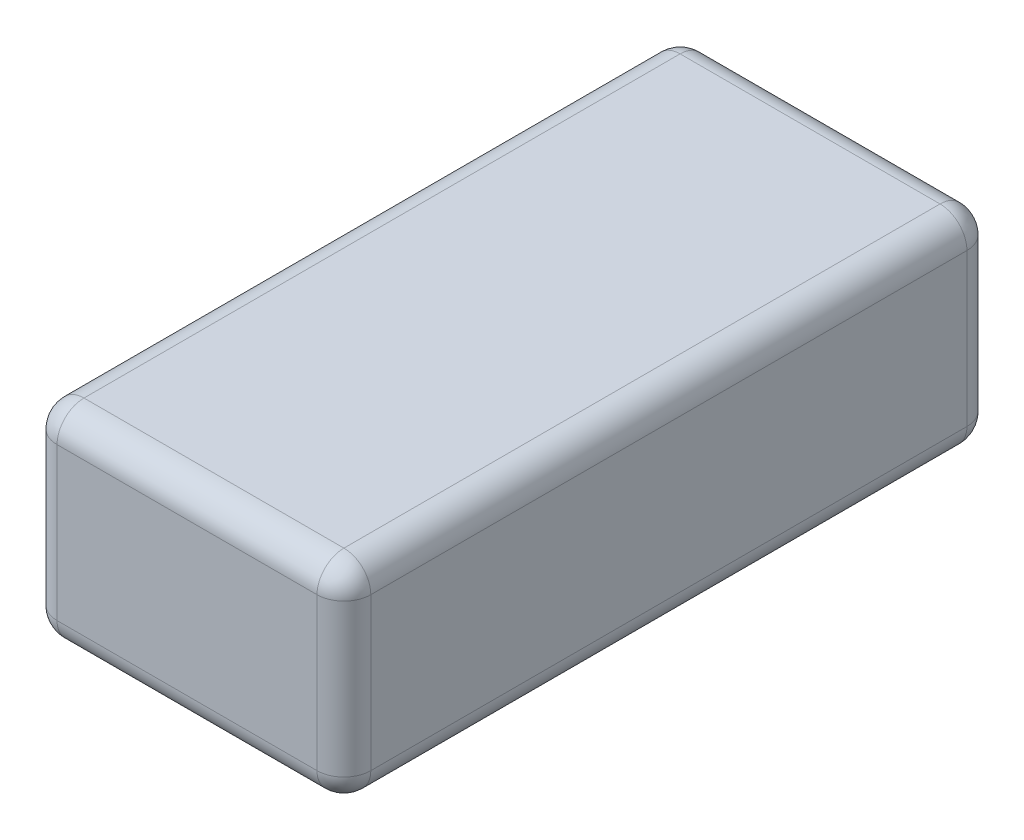
ISO-10303-21;
HEADER;
FILE_DESCRIPTION(('STEP AP214'),'2;1');
FILE_NAME('part.step','',(''),(''),'','','');
FILE_SCHEMA(('AUTOMOTIVE_DESIGN { 1 0 10303 214 1 1 1 1 }'));
ENDSEC;
DATA;
#1=APPLICATION_CONTEXT('core data for automotive mechanical design processes');
#2=APPLICATION_PROTOCOL_DEFINITION('international standard','automotive_design',2000,#1);
#3=PRODUCT_CONTEXT('',#1,'mechanical');
#4=PRODUCT('Part','Part','',(#3));
#5=PRODUCT_RELATED_PRODUCT_CATEGORY('part','',(#4));
#6=PRODUCT_DEFINITION_FORMATION('','',#4);
#7=PRODUCT_DEFINITION_CONTEXT('part definition',#1,'design');
#8=PRODUCT_DEFINITION('design','',#6,#7);
#9=PRODUCT_DEFINITION_SHAPE('','',#8);
#10=(LENGTH_UNIT() NAMED_UNIT(*) SI_UNIT(.MILLI.,.METRE.));
#11=(NAMED_UNIT(*) PLANE_ANGLE_UNIT() SI_UNIT($,.RADIAN.));
#12=(NAMED_UNIT(*) SI_UNIT($,.STERADIAN.) SOLID_ANGLE_UNIT());
#13=UNCERTAINTY_MEASURE_WITH_UNIT(LENGTH_MEASURE(1.E-05),#10,'distance_accuracy_value','');
#14=(GEOMETRIC_REPRESENTATION_CONTEXT(3) GLOBAL_UNCERTAINTY_ASSIGNED_CONTEXT((#13)) GLOBAL_UNIT_ASSIGNED_CONTEXT((#10,
#11,#12)) REPRESENTATION_CONTEXT('',''));
#15=CARTESIAN_POINT('',(0.,0.,0.));
#16=DIRECTION('',(0.,0.,1.));
#17=DIRECTION('',(1.,0.,0.));
#18=AXIS2_PLACEMENT_3D('',#15,#16,#17);
#19=CARTESIAN_POINT('',(17.5,23.,-36.25));
#20=DIRECTION('',(-1.,0.,0.));
#21=DIRECTION('',(0.,0.,1.));
#22=AXIS2_PLACEMENT_3D('',#19,#20,#21);
#23=PLANE('',#22);
#24=DIRECTION('',(0.,-1.,0.));
#25=VECTOR('',#24,1.);
#26=CARTESIAN_POINT('',(17.5,23.,33.25));
#27=LINE('',#26,#25);
#28=CARTESIAN_POINT('',(17.5,20.,33.25));
#29=VERTEX_POINT('',#28);
#30=CARTESIAN_POINT('',(17.5,3.,33.25));
#31=VERTEX_POINT('',#30);
#32=EDGE_CURVE('E184',#29,#31,#27,.T.);
#33=ORIENTED_EDGE('',*,*,#32,.T.);
#34=DIRECTION('',(0.,0.,-1.));
#35=VECTOR('',#34,1.);
#36=CARTESIAN_POINT('',(17.5,3.,-36.25));
#37=LINE('',#36,#35);
#38=CARTESIAN_POINT('',(17.5,3.,-33.25));
#39=VERTEX_POINT('',#38);
#40=EDGE_CURVE('E187',#31,#39,#37,.T.);
#41=ORIENTED_EDGE('',*,*,#40,.T.);
#42=DIRECTION('',(0.,-1.,0.));
#43=VECTOR('',#42,1.);
#44=CARTESIAN_POINT('',(17.5,23.,-33.25));
#45=LINE('',#44,#43);
#46=CARTESIAN_POINT('',(17.5,20.,-33.25));
#47=VERTEX_POINT('',#46);
#48=EDGE_CURVE('E182',#39,#47,#45,.F.);
#49=ORIENTED_EDGE('',*,*,#48,.T.);
#50=DIRECTION('',(0.,0.,-1.));
#51=VECTOR('',#50,1.);
#52=CARTESIAN_POINT('',(17.5,20.,36.25));
#53=LINE('',#52,#51);
#54=EDGE_CURVE('E180',#47,#29,#53,.F.);
#55=ORIENTED_EDGE('',*,*,#54,.T.);
#56=EDGE_LOOP('',(#33,#41,#49,#55));
#57=FACE_BOUND('',#56,.T.);
#58=ADVANCED_FACE('F33',(#57),#23,.F.);
#59=CARTESIAN_POINT('',(-17.5,23.,-36.25));
#60=DIRECTION('',(0.,0.,1.));
#61=DIRECTION('',(1.,0.,0.));
#62=AXIS2_PLACEMENT_3D('',#59,#60,#61);
#63=PLANE('',#62);
#64=DIRECTION('',(0.,-1.,0.));
#65=VECTOR('',#64,1.);
#66=CARTESIAN_POINT('',(14.5,23.,-36.25));
#67=LINE('',#66,#65);
#68=CARTESIAN_POINT('',(14.5,20.,-36.25));
#69=VERTEX_POINT('',#68);
#70=CARTESIAN_POINT('',(14.5,3.,-36.25));
#71=VERTEX_POINT('',#70);
#72=EDGE_CURVE('E166',#69,#71,#67,.T.);
#73=ORIENTED_EDGE('',*,*,#72,.T.);
#74=DIRECTION('',(-1.,0.,0.));
#75=VECTOR('',#74,1.);
#76=CARTESIAN_POINT('',(-17.5,3.,-36.25));
#77=LINE('',#76,#75);
#78=CARTESIAN_POINT('',(-14.5,3.,-36.25));
#79=VERTEX_POINT('',#78);
#80=EDGE_CURVE('E171',#71,#79,#77,.T.);
#81=ORIENTED_EDGE('',*,*,#80,.T.);
#82=DIRECTION('',(0.,-1.,0.));
#83=VECTOR('',#82,1.);
#84=CARTESIAN_POINT('',(-14.5,23.,-36.25));
#85=LINE('',#84,#83);
#86=CARTESIAN_POINT('',(-14.5,20.,-36.25));
#87=VERTEX_POINT('',#86);
#88=EDGE_CURVE('E168',#79,#87,#85,.F.);
#89=ORIENTED_EDGE('',*,*,#88,.T.);
#90=DIRECTION('',(-1.,0.,0.));
#91=VECTOR('',#90,1.);
#92=CARTESIAN_POINT('',(17.5,20.,-36.25));
#93=LINE('',#92,#91);
#94=EDGE_CURVE('E164',#87,#69,#93,.F.);
#95=ORIENTED_EDGE('',*,*,#94,.T.);
#96=EDGE_LOOP('',(#73,#81,#89,#95));
#97=FACE_BOUND('',#96,.T.);
#98=ADVANCED_FACE('F305',(#97),#63,.F.);
#99=CARTESIAN_POINT('',(-17.5,23.,-36.25));
#100=DIRECTION('',(1.,0.,0.));
#101=DIRECTION('',(0.,0.,-1.));
#102=AXIS2_PLACEMENT_3D('',#99,#100,#101);
#103=PLANE('',#102);
#104=DIRECTION('',(0.,-1.,0.));
#105=VECTOR('',#104,1.);
#106=CARTESIAN_POINT('',(-17.5,23.,-33.25));
#107=LINE('',#106,#105);
#108=CARTESIAN_POINT('',(-17.5,20.,-33.25));
#109=VERTEX_POINT('',#108);
#110=CARTESIAN_POINT('',(-17.5,3.,-33.25));
#111=VERTEX_POINT('',#110);
#112=EDGE_CURVE('E132',#109,#111,#107,.T.);
#113=ORIENTED_EDGE('',*,*,#112,.T.);
#114=DIRECTION('',(0.,0.,1.));
#115=VECTOR('',#114,1.);
#116=CARTESIAN_POINT('',(-17.5,3.,-36.25));
#117=LINE('',#116,#115);
#118=CARTESIAN_POINT('',(-17.5,3.,33.25));
#119=VERTEX_POINT('',#118);
#120=EDGE_CURVE('E128',#111,#119,#117,.T.);
#121=ORIENTED_EDGE('',*,*,#120,.T.);
#122=DIRECTION('',(0.,-1.,0.));
#123=VECTOR('',#122,1.);
#124=CARTESIAN_POINT('',(-17.5,23.,33.25));
#125=LINE('',#124,#123);
#126=CARTESIAN_POINT('',(-17.5,20.,33.25));
#127=VERTEX_POINT('',#126);
#128=EDGE_CURVE('E120',#119,#127,#125,.F.);
#129=ORIENTED_EDGE('',*,*,#128,.T.);
#130=DIRECTION('',(0.,0.,1.));
#131=VECTOR('',#130,1.);
#132=CARTESIAN_POINT('',(-17.5,20.,-36.25));
#133=LINE('',#132,#131);
#134=EDGE_CURVE('E125',#127,#109,#133,.F.);
#135=ORIENTED_EDGE('',*,*,#134,.T.);
#136=EDGE_LOOP('',(#113,#121,#129,#135));
#137=FACE_BOUND('',#136,.T.);
#138=ADVANCED_FACE('F123',(#137),#103,.F.);
#139=CARTESIAN_POINT('',(-17.5,23.,36.25));
#140=DIRECTION('',(0.,0.,-1.));
#141=DIRECTION('',(-1.,0.,0.));
#142=AXIS2_PLACEMENT_3D('',#139,#140,#141);
#143=PLANE('',#142);
#144=DIRECTION('',(0.,-1.,0.));
#145=VECTOR('',#144,1.);
#146=CARTESIAN_POINT('',(-14.5,23.,36.25));
#147=LINE('',#146,#145);
#148=CARTESIAN_POINT('',(-14.5,20.,36.25));
#149=VERTEX_POINT('',#148);
#150=CARTESIAN_POINT('',(-14.5,3.,36.25));
#151=VERTEX_POINT('',#150);
#152=EDGE_CURVE('E140',#149,#151,#147,.T.);
#153=ORIENTED_EDGE('',*,*,#152,.T.);
#154=DIRECTION('',(1.,0.,0.));
#155=VECTOR('',#154,1.);
#156=CARTESIAN_POINT('',(-17.5,3.,36.25));
#157=LINE('',#156,#155);
#158=CARTESIAN_POINT('',(14.5,3.,36.25));
#159=VERTEX_POINT('',#158);
#160=EDGE_CURVE('E178',#151,#159,#157,.T.);
#161=ORIENTED_EDGE('',*,*,#160,.T.);
#162=DIRECTION('',(0.,-1.,0.));
#163=VECTOR('',#162,1.);
#164=CARTESIAN_POINT('',(14.5,23.,36.25));
#165=LINE('',#164,#163);
#166=CARTESIAN_POINT('',(14.5,20.,36.25));
#167=VERTEX_POINT('',#166);
#168=EDGE_CURVE('E175',#159,#167,#165,.F.);
#169=ORIENTED_EDGE('',*,*,#168,.T.);
#170=DIRECTION('',(1.,0.,0.));
#171=VECTOR('',#170,1.);
#172=CARTESIAN_POINT('',(-17.5,20.,36.25));
#173=LINE('',#172,#171);
#174=EDGE_CURVE('E173',#167,#149,#173,.F.);
#175=ORIENTED_EDGE('',*,*,#174,.T.);
#176=EDGE_LOOP('',(#153,#161,#169,#175));
#177=FACE_BOUND('',#176,.T.);
#178=ADVANCED_FACE('F296',(#177),#143,.F.);
#179=CARTESIAN_POINT('',(0.,23.,0.));
#180=DIRECTION('',(0.,1.,0.));
#181=DIRECTION('',(0.,0.,1.));
#182=AXIS2_PLACEMENT_3D('',#179,#180,#181);
#183=PLANE('',#182);
#184=DIRECTION('',(0.,0.,1.));
#185=VECTOR('',#184,1.);
#186=CARTESIAN_POINT('',(-14.5,23.,36.25));
#187=LINE('',#186,#185);
#188=CARTESIAN_POINT('',(-14.5,23.,-33.25));
#189=VERTEX_POINT('',#188);
#190=CARTESIAN_POINT('',(-14.5,23.,33.25));
#191=VERTEX_POINT('',#190);
#192=EDGE_CURVE('E42',#189,#191,#187,.T.);
#193=ORIENTED_EDGE('',*,*,#192,.T.);
#194=DIRECTION('',(1.,0.,0.));
#195=VECTOR('',#194,1.);
#196=CARTESIAN_POINT('',(17.5,23.,33.25));
#197=LINE('',#196,#195);
#198=CARTESIAN_POINT('',(14.5,23.,33.25));
#199=VERTEX_POINT('',#198);
#200=EDGE_CURVE('E11',#191,#199,#197,.T.);
#201=ORIENTED_EDGE('',*,*,#200,.T.);
#202=DIRECTION('',(0.,0.,-1.));
#203=VECTOR('',#202,1.);
#204=CARTESIAN_POINT('',(14.5,23.,-36.25));
#205=LINE('',#204,#203);
#206=CARTESIAN_POINT('',(14.5,23.,-33.25));
#207=VERTEX_POINT('',#206);
#208=EDGE_CURVE('E198',#199,#207,#205,.T.);
#209=ORIENTED_EDGE('',*,*,#208,.T.);
#210=DIRECTION('',(-1.,0.,0.));
#211=VECTOR('',#210,1.);
#212=CARTESIAN_POINT('',(-17.5,23.,-33.25));
#213=LINE('',#212,#211);
#214=EDGE_CURVE('E53',#207,#189,#213,.T.);
#215=ORIENTED_EDGE('',*,*,#214,.T.);
#216=EDGE_LOOP('',(#193,#201,#209,#215));
#217=FACE_BOUND('',#216,.T.);
#218=ADVANCED_FACE('F298',(#217),#183,.T.);
#219=CARTESIAN_POINT('',(0.,0.,0.));
#220=DIRECTION('',(0.,1.,0.));
#221=DIRECTION('',(0.,0.,1.));
#222=AXIS2_PLACEMENT_3D('',#219,#220,#221);
#223=PLANE('',#222);
#224=DIRECTION('',(0.,0.,1.));
#225=VECTOR('',#224,1.);
#226=CARTESIAN_POINT('',(-14.5,0.,0.));
#227=LINE('',#226,#225);
#228=CARTESIAN_POINT('',(-14.5,0.,33.25));
#229=VERTEX_POINT('',#228);
#230=CARTESIAN_POINT('',(-14.5,0.,-33.25));
#231=VERTEX_POINT('',#230);
#232=EDGE_CURVE('E193',#229,#231,#227,.F.);
#233=ORIENTED_EDGE('',*,*,#232,.T.);
#234=DIRECTION('',(-1.,0.,0.));
#235=VECTOR('',#234,1.);
#236=CARTESIAN_POINT('',(0.,0.,-33.25));
#237=LINE('',#236,#235);
#238=CARTESIAN_POINT('',(14.5,0.,-33.25));
#239=VERTEX_POINT('',#238);
#240=EDGE_CURVE('E195',#231,#239,#237,.F.);
#241=ORIENTED_EDGE('',*,*,#240,.T.);
#242=DIRECTION('',(0.,0.,-1.));
#243=VECTOR('',#242,1.);
#244=CARTESIAN_POINT('',(14.5,0.,0.));
#245=LINE('',#244,#243);
#246=CARTESIAN_POINT('',(14.5,0.,33.25));
#247=VERTEX_POINT('',#246);
#248=EDGE_CURVE('E189',#239,#247,#245,.F.);
#249=ORIENTED_EDGE('',*,*,#248,.T.);
#250=DIRECTION('',(1.,0.,0.));
#251=VECTOR('',#250,1.);
#252=CARTESIAN_POINT('',(0.,0.,33.25));
#253=LINE('',#252,#251);
#254=EDGE_CURVE('E191',#247,#229,#253,.F.);
#255=ORIENTED_EDGE('',*,*,#254,.T.);
#256=EDGE_LOOP('',(#233,#241,#249,#255));
#257=FACE_BOUND('',#256,.T.);
#258=ADVANCED_FACE('F265',(#257),#223,.F.);
#259=CARTESIAN_POINT('',(14.5,23.,33.25));
#260=DIRECTION('',(0.,-1.,0.));
#261=DIRECTION('',(0.,0.,-1.));
#262=AXIS2_PLACEMENT_3D('',#259,#260,#261);
#263=CYLINDRICAL_SURFACE('',#262,3.);
#264=CARTESIAN_POINT('',(14.5,20.,33.25));
#265=DIRECTION('',(0.,1.,0.));
#266=DIRECTION('',(0.,0.,1.));
#267=AXIS2_PLACEMENT_3D('',#264,#265,#266);
#268=CIRCLE('',#267,3.);
#269=EDGE_CURVE('E37',#167,#29,#268,.T.);
#270=ORIENTED_EDGE('',*,*,#269,.F.);
#271=ORIENTED_EDGE('',*,*,#168,.F.);
#272=CARTESIAN_POINT('',(14.5,3.,33.25));
#273=DIRECTION('',(0.,-1.,0.));
#274=DIRECTION('',(0.,0.,-1.));
#275=AXIS2_PLACEMENT_3D('',#272,#273,#274);
#276=CIRCLE('',#275,3.);
#277=EDGE_CURVE('E160',#31,#159,#276,.T.);
#278=ORIENTED_EDGE('',*,*,#277,.F.);
#279=ORIENTED_EDGE('',*,*,#32,.F.);
#280=EDGE_LOOP('',(#270,#271,#278,#279));
#281=FACE_BOUND('',#280,.T.);
#282=ADVANCED_FACE('F35',(#281),#263,.T.);
#283=CARTESIAN_POINT('',(14.5,20.,33.25));
#284=DIRECTION('',(0.,0.,1.));
#285=DIRECTION('',(1.,0.,0.));
#286=AXIS2_PLACEMENT_3D('',#283,#284,#285);
#287=SPHERICAL_SURFACE('',#286,3.);
#288=CARTESIAN_POINT('',(14.5,20.,33.25));
#289=DIRECTION('',(1.,0.,0.));
#290=DIRECTION('',(0.,0.,-1.));
#291=AXIS2_PLACEMENT_3D('',#288,#289,#290);
#292=CIRCLE('',#291,3.);
#293=EDGE_CURVE('E244',#167,#199,#292,.F.);
#294=ORIENTED_EDGE('',*,*,#293,.F.);
#295=ORIENTED_EDGE('',*,*,#269,.T.);
#296=CARTESIAN_POINT('',(14.5,20.,33.25));
#297=DIRECTION('',(0.,0.,1.));
#298=DIRECTION('',(1.,0.,0.));
#299=AXIS2_PLACEMENT_3D('',#296,#297,#298);
#300=CIRCLE('',#299,3.);
#301=EDGE_CURVE('E247',#199,#29,#300,.F.);
#302=ORIENTED_EDGE('',*,*,#301,.F.);
#303=EDGE_LOOP('',(#294,#295,#302));
#304=FACE_BOUND('',#303,.T.);
#305=ADVANCED_FACE('F291',(#304),#287,.T.);
#306=CARTESIAN_POINT('',(14.5,3.,33.25));
#307=DIRECTION('',(0.,0.,1.));
#308=DIRECTION('',(1.,0.,0.));
#309=AXIS2_PLACEMENT_3D('',#306,#307,#308);
#310=SPHERICAL_SURFACE('',#309,3.);
#311=CARTESIAN_POINT('',(14.5,3.,33.25));
#312=DIRECTION('',(0.,0.,1.));
#313=DIRECTION('',(1.,0.,0.));
#314=AXIS2_PLACEMENT_3D('',#311,#312,#313);
#315=CIRCLE('',#314,3.);
#316=EDGE_CURVE('E238',#31,#247,#315,.F.);
#317=ORIENTED_EDGE('',*,*,#316,.F.);
#318=ORIENTED_EDGE('',*,*,#277,.T.);
#319=CARTESIAN_POINT('',(14.5,3.,33.25));
#320=DIRECTION('',(1.,0.,0.));
#321=DIRECTION('',(0.,0.,-1.));
#322=AXIS2_PLACEMENT_3D('',#319,#320,#321);
#323=CIRCLE('',#322,3.);
#324=EDGE_CURVE('E241',#247,#159,#323,.F.);
#325=ORIENTED_EDGE('',*,*,#324,.F.);
#326=EDGE_LOOP('',(#317,#318,#325));
#327=FACE_BOUND('',#326,.T.);
#328=ADVANCED_FACE('F254',(#327),#310,.T.);
#329=CARTESIAN_POINT('',(14.5,20.,0.));
#330=DIRECTION('',(0.,0.,1.));
#331=DIRECTION('',(1.,0.,0.));
#332=AXIS2_PLACEMENT_3D('',#329,#330,#331);
#333=CYLINDRICAL_SURFACE('',#332,3.);
#334=ORIENTED_EDGE('',*,*,#301,.T.);
#335=ORIENTED_EDGE('',*,*,#54,.F.);
#336=CARTESIAN_POINT('',(14.5,20.,-33.25));
#337=DIRECTION('',(0.,0.,-1.));
#338=DIRECTION('',(-1.,0.,0.));
#339=AXIS2_PLACEMENT_3D('',#336,#337,#338);
#340=CIRCLE('',#339,3.);
#341=EDGE_CURVE('E232',#207,#47,#340,.T.);
#342=ORIENTED_EDGE('',*,*,#341,.F.);
#343=ORIENTED_EDGE('',*,*,#208,.F.);
#344=EDGE_LOOP('',(#334,#335,#342,#343));
#345=FACE_BOUND('',#344,.T.);
#346=ADVANCED_FACE('F286',(#345),#333,.T.);
#347=CARTESIAN_POINT('',(0.,20.,33.25));
#348=DIRECTION('',(-1.,0.,0.));
#349=DIRECTION('',(0.,0.,1.));
#350=AXIS2_PLACEMENT_3D('',#347,#348,#349);
#351=CYLINDRICAL_SURFACE('',#350,3.);
#352=ORIENTED_EDGE('',*,*,#293,.T.);
#353=ORIENTED_EDGE('',*,*,#200,.F.);
#354=CARTESIAN_POINT('',(-14.5,20.,33.25));
#355=DIRECTION('',(-1.,0.,0.));
#356=DIRECTION('',(0.,0.,1.));
#357=AXIS2_PLACEMENT_3D('',#354,#355,#356);
#358=CIRCLE('',#357,3.);
#359=EDGE_CURVE('E144',#149,#191,#358,.T.);
#360=ORIENTED_EDGE('',*,*,#359,.F.);
#361=ORIENTED_EDGE('',*,*,#174,.F.);
#362=EDGE_LOOP('',(#352,#353,#360,#361));
#363=FACE_BOUND('',#362,.T.);
#364=ADVANCED_FACE('F294',(#363),#351,.T.);
#365=CARTESIAN_POINT('',(-14.5,23.,33.25));
#366=DIRECTION('',(0.,-1.,0.));
#367=DIRECTION('',(0.,0.,-1.));
#368=AXIS2_PLACEMENT_3D('',#365,#366,#367);
#369=CYLINDRICAL_SURFACE('',#368,3.);
#370=CARTESIAN_POINT('',(-14.5,3.,33.25));
#371=DIRECTION('',(0.,-1.,0.));
#372=DIRECTION('',(0.,0.,-1.));
#373=AXIS2_PLACEMENT_3D('',#370,#371,#372);
#374=CIRCLE('',#373,3.);
#375=EDGE_CURVE('E145',#151,#119,#374,.T.);
#376=ORIENTED_EDGE('',*,*,#375,.F.);
#377=ORIENTED_EDGE('',*,*,#152,.F.);
#378=CARTESIAN_POINT('',(-14.5,20.,33.25));
#379=DIRECTION('',(0.,1.,0.));
#380=DIRECTION('',(0.,0.,1.));
#381=AXIS2_PLACEMENT_3D('',#378,#379,#380);
#382=CIRCLE('',#381,3.);
#383=EDGE_CURVE('E136',#127,#149,#382,.T.);
#384=ORIENTED_EDGE('',*,*,#383,.F.);
#385=ORIENTED_EDGE('',*,*,#128,.F.);
#386=EDGE_LOOP('',(#376,#377,#384,#385));
#387=FACE_BOUND('',#386,.T.);
#388=ADVANCED_FACE('F138',(#387),#369,.T.);
#389=CARTESIAN_POINT('',(-17.5,3.,33.25));
#390=DIRECTION('',(1.,0.,0.));
#391=DIRECTION('',(0.,0.,-1.));
#392=AXIS2_PLACEMENT_3D('',#389,#390,#391);
#393=CYLINDRICAL_SURFACE('',#392,3.);
#394=ORIENTED_EDGE('',*,*,#324,.T.);
#395=ORIENTED_EDGE('',*,*,#160,.F.);
#396=CARTESIAN_POINT('',(-14.5,3.,33.25));
#397=DIRECTION('',(-1.,0.,0.));
#398=DIRECTION('',(0.,0.,1.));
#399=AXIS2_PLACEMENT_3D('',#396,#397,#398);
#400=CIRCLE('',#399,3.);
#401=EDGE_CURVE('E228',#229,#151,#400,.T.);
#402=ORIENTED_EDGE('',*,*,#401,.F.);
#403=ORIENTED_EDGE('',*,*,#254,.F.);
#404=EDGE_LOOP('',(#394,#395,#402,#403));
#405=FACE_BOUND('',#404,.T.);
#406=ADVANCED_FACE('F261',(#405),#393,.T.);
#407=CARTESIAN_POINT('',(14.5,3.,-36.25));
#408=DIRECTION('',(0.,0.,-1.));
#409=DIRECTION('',(-1.,0.,0.));
#410=AXIS2_PLACEMENT_3D('',#407,#408,#409);
#411=CYLINDRICAL_SURFACE('',#410,3.);
#412=ORIENTED_EDGE('',*,*,#316,.T.);
#413=ORIENTED_EDGE('',*,*,#248,.F.);
#414=CARTESIAN_POINT('',(14.5,3.,-33.25));
#415=DIRECTION('',(0.,0.,-1.));
#416=DIRECTION('',(-1.,0.,0.));
#417=AXIS2_PLACEMENT_3D('',#414,#415,#416);
#418=CIRCLE('',#417,3.);
#419=EDGE_CURVE('E225',#39,#239,#418,.T.);
#420=ORIENTED_EDGE('',*,*,#419,.F.);
#421=ORIENTED_EDGE('',*,*,#40,.F.);
#422=EDGE_LOOP('',(#412,#413,#420,#421));
#423=FACE_BOUND('',#422,.T.);
#424=ADVANCED_FACE('F271',(#423),#411,.T.);
#425=CARTESIAN_POINT('',(14.5,23.,-33.25));
#426=DIRECTION('',(0.,-1.,0.));
#427=DIRECTION('',(0.,0.,-1.));
#428=AXIS2_PLACEMENT_3D('',#425,#426,#427);
#429=CYLINDRICAL_SURFACE('',#428,3.);
#430=CARTESIAN_POINT('',(14.5,20.,-33.25));
#431=DIRECTION('',(0.,1.,0.));
#432=DIRECTION('',(0.,0.,1.));
#433=AXIS2_PLACEMENT_3D('',#430,#431,#432);
#434=CIRCLE('',#433,3.);
#435=EDGE_CURVE('E235',#47,#69,#434,.T.);
#436=ORIENTED_EDGE('',*,*,#435,.F.);
#437=ORIENTED_EDGE('',*,*,#48,.F.);
#438=CARTESIAN_POINT('',(14.5,3.,-33.25));
#439=DIRECTION('',(0.,-1.,0.));
#440=DIRECTION('',(0.,0.,-1.));
#441=AXIS2_PLACEMENT_3D('',#438,#439,#440);
#442=CIRCLE('',#441,3.);
#443=EDGE_CURVE('E222',#71,#39,#442,.T.);
#444=ORIENTED_EDGE('',*,*,#443,.F.);
#445=ORIENTED_EDGE('',*,*,#72,.F.);
#446=EDGE_LOOP('',(#436,#437,#444,#445));
#447=FACE_BOUND('',#446,.T.);
#448=ADVANCED_FACE('F278',(#447),#429,.T.);
#449=CARTESIAN_POINT('',(14.5,20.,-33.25));
#450=DIRECTION('',(0.,0.,1.));
#451=DIRECTION('',(1.,0.,0.));
#452=AXIS2_PLACEMENT_3D('',#449,#450,#451);
#453=SPHERICAL_SURFACE('',#452,3.);
#454=ORIENTED_EDGE('',*,*,#341,.T.);
#455=ORIENTED_EDGE('',*,*,#435,.T.);
#456=CARTESIAN_POINT('',(14.5,20.,-33.25));
#457=DIRECTION('',(1.,0.,0.));
#458=DIRECTION('',(0.,1.,0.));
#459=AXIS2_PLACEMENT_3D('',#456,#457,#458);
#460=CIRCLE('',#459,3.);
#461=EDGE_CURVE('E151',#207,#69,#460,.F.);
#462=ORIENTED_EDGE('',*,*,#461,.F.);
#463=EDGE_LOOP('',(#454,#455,#462));
#464=FACE_BOUND('',#463,.T.);
#465=ADVANCED_FACE('F284',(#464),#453,.T.);
#466=CARTESIAN_POINT('',(-14.5,20.,33.25));
#467=DIRECTION('',(0.,0.,1.));
#468=DIRECTION('',(1.,0.,0.));
#469=AXIS2_PLACEMENT_3D('',#466,#467,#468);
#470=SPHERICAL_SURFACE('',#469,3.);
#471=ORIENTED_EDGE('',*,*,#383,.T.);
#472=ORIENTED_EDGE('',*,*,#359,.T.);
#473=CARTESIAN_POINT('',(-14.5,20.,33.25));
#474=DIRECTION('',(0.,0.,1.));
#475=DIRECTION('',(1.,0.,0.));
#476=AXIS2_PLACEMENT_3D('',#473,#474,#475);
#477=CIRCLE('',#476,3.);
#478=EDGE_CURVE('E148',#127,#191,#477,.F.);
#479=ORIENTED_EDGE('',*,*,#478,.F.);
#480=EDGE_LOOP('',(#471,#472,#479));
#481=FACE_BOUND('',#480,.T.);
#482=ADVANCED_FACE('F149',(#481),#470,.T.);
#483=CARTESIAN_POINT('',(-14.5,3.,33.25));
#484=DIRECTION('',(0.,0.,1.));
#485=DIRECTION('',(1.,0.,0.));
#486=AXIS2_PLACEMENT_3D('',#483,#484,#485);
#487=SPHERICAL_SURFACE('',#486,3.);
#488=ORIENTED_EDGE('',*,*,#401,.T.);
#489=ORIENTED_EDGE('',*,*,#375,.T.);
#490=CARTESIAN_POINT('',(-14.5,3.,33.25));
#491=DIRECTION('',(0.,0.,1.));
#492=DIRECTION('',(1.,0.,0.));
#493=AXIS2_PLACEMENT_3D('',#490,#491,#492);
#494=CIRCLE('',#493,3.);
#495=EDGE_CURVE('E152',#229,#119,#494,.F.);
#496=ORIENTED_EDGE('',*,*,#495,.F.);
#497=EDGE_LOOP('',(#488,#489,#496));
#498=FACE_BOUND('',#497,.T.);
#499=ADVANCED_FACE('F345',(#498),#487,.T.);
#500=CARTESIAN_POINT('',(14.5,3.,-33.25));
#501=DIRECTION('',(0.,0.,1.));
#502=DIRECTION('',(1.,0.,0.));
#503=AXIS2_PLACEMENT_3D('',#500,#501,#502);
#504=SPHERICAL_SURFACE('',#503,3.);
#505=ORIENTED_EDGE('',*,*,#443,.T.);
#506=ORIENTED_EDGE('',*,*,#419,.T.);
#507=CARTESIAN_POINT('',(14.5,3.,-33.25));
#508=DIRECTION('',(1.,0.,0.));
#509=DIRECTION('',(0.,0.,-1.));
#510=AXIS2_PLACEMENT_3D('',#507,#508,#509);
#511=CIRCLE('',#510,3.);
#512=EDGE_CURVE('E216',#71,#239,#511,.F.);
#513=ORIENTED_EDGE('',*,*,#512,.F.);
#514=EDGE_LOOP('',(#505,#506,#513));
#515=FACE_BOUND('',#514,.T.);
#516=ADVANCED_FACE('F341',(#515),#504,.T.);
#517=CARTESIAN_POINT('',(0.,20.,-33.25));
#518=DIRECTION('',(1.,0.,0.));
#519=DIRECTION('',(0.,0.,-1.));
#520=AXIS2_PLACEMENT_3D('',#517,#518,#519);
#521=CYLINDRICAL_SURFACE('',#520,3.);
#522=ORIENTED_EDGE('',*,*,#461,.T.);
#523=ORIENTED_EDGE('',*,*,#94,.F.);
#524=CARTESIAN_POINT('',(-14.5,20.,-33.25));
#525=DIRECTION('',(-1.,0.,0.));
#526=DIRECTION('',(0.,0.,1.));
#527=AXIS2_PLACEMENT_3D('',#524,#525,#526);
#528=CIRCLE('',#527,3.);
#529=EDGE_CURVE('E213',#189,#87,#528,.T.);
#530=ORIENTED_EDGE('',*,*,#529,.F.);
#531=ORIENTED_EDGE('',*,*,#214,.F.);
#532=EDGE_LOOP('',(#522,#523,#530,#531));
#533=FACE_BOUND('',#532,.T.);
#534=ADVANCED_FACE('F338',(#533),#521,.T.);
#535=CARTESIAN_POINT('',(-14.5,20.,0.));
#536=DIRECTION('',(0.,0.,-1.));
#537=DIRECTION('',(-1.,0.,0.));
#538=AXIS2_PLACEMENT_3D('',#535,#536,#537);
#539=CYLINDRICAL_SURFACE('',#538,3.);
#540=ORIENTED_EDGE('',*,*,#478,.T.);
#541=ORIENTED_EDGE('',*,*,#192,.F.);
#542=CARTESIAN_POINT('',(-14.5,20.,-33.25));
#543=DIRECTION('',(0.,0.,-1.));
#544=DIRECTION('',(-1.,0.,0.));
#545=AXIS2_PLACEMENT_3D('',#542,#543,#544);
#546=CIRCLE('',#545,3.);
#547=EDGE_CURVE('E156',#109,#189,#546,.T.);
#548=ORIENTED_EDGE('',*,*,#547,.F.);
#549=ORIENTED_EDGE('',*,*,#134,.F.);
#550=EDGE_LOOP('',(#540,#541,#548,#549));
#551=FACE_BOUND('',#550,.T.);
#552=ADVANCED_FACE('F154',(#551),#539,.T.);
#553=CARTESIAN_POINT('',(-14.5,3.,-36.25));
#554=DIRECTION('',(0.,0.,1.));
#555=DIRECTION('',(1.,0.,0.));
#556=AXIS2_PLACEMENT_3D('',#553,#554,#555);
#557=CYLINDRICAL_SURFACE('',#556,3.);
#558=ORIENTED_EDGE('',*,*,#495,.T.);
#559=ORIENTED_EDGE('',*,*,#120,.F.);
#560=CARTESIAN_POINT('',(-14.5,3.,-33.25));
#561=DIRECTION('',(0.,0.,-1.));
#562=DIRECTION('',(-1.,0.,0.));
#563=AXIS2_PLACEMENT_3D('',#560,#561,#562);
#564=CIRCLE('',#563,3.);
#565=EDGE_CURVE('E209',#231,#111,#564,.T.);
#566=ORIENTED_EDGE('',*,*,#565,.F.);
#567=ORIENTED_EDGE('',*,*,#232,.F.);
#568=EDGE_LOOP('',(#558,#559,#566,#567));
#569=FACE_BOUND('',#568,.T.);
#570=ADVANCED_FACE('F331',(#569),#557,.T.);
#571=CARTESIAN_POINT('',(-17.5,3.,-33.25));
#572=DIRECTION('',(-1.,0.,0.));
#573=DIRECTION('',(0.,0.,1.));
#574=AXIS2_PLACEMENT_3D('',#571,#572,#573);
#575=CYLINDRICAL_SURFACE('',#574,3.);
#576=ORIENTED_EDGE('',*,*,#512,.T.);
#577=ORIENTED_EDGE('',*,*,#240,.F.);
#578=CARTESIAN_POINT('',(-14.5,3.,-33.25));
#579=DIRECTION('',(-1.,0.,0.));
#580=DIRECTION('',(0.,0.,1.));
#581=AXIS2_PLACEMENT_3D('',#578,#579,#580);
#582=CIRCLE('',#581,3.);
#583=EDGE_CURVE('E206',#79,#231,#582,.T.);
#584=ORIENTED_EDGE('',*,*,#583,.F.);
#585=ORIENTED_EDGE('',*,*,#80,.F.);
#586=EDGE_LOOP('',(#576,#577,#584,#585));
#587=FACE_BOUND('',#586,.T.);
#588=ADVANCED_FACE('F327',(#587),#575,.T.);
#589=CARTESIAN_POINT('',(-14.5,20.,-33.25));
#590=DIRECTION('',(0.,0.,1.));
#591=DIRECTION('',(1.,0.,0.));
#592=AXIS2_PLACEMENT_3D('',#589,#590,#591);
#593=SPHERICAL_SURFACE('',#592,3.);
#594=ORIENTED_EDGE('',*,*,#547,.T.);
#595=ORIENTED_EDGE('',*,*,#529,.T.);
#596=CARTESIAN_POINT('',(-14.5,20.,-33.25));
#597=DIRECTION('',(0.,1.,0.));
#598=DIRECTION('',(0.,0.,1.));
#599=AXIS2_PLACEMENT_3D('',#596,#597,#598);
#600=CIRCLE('',#599,3.);
#601=EDGE_CURVE('E204',#109,#87,#600,.F.);
#602=ORIENTED_EDGE('',*,*,#601,.F.);
#603=EDGE_LOOP('',(#594,#595,#602));
#604=FACE_BOUND('',#603,.T.);
#605=ADVANCED_FACE('F323',(#604),#593,.T.);
#606=CARTESIAN_POINT('',(-14.5,3.,-33.25));
#607=DIRECTION('',(0.,0.,1.));
#608=DIRECTION('',(1.,0.,0.));
#609=AXIS2_PLACEMENT_3D('',#606,#607,#608);
#610=SPHERICAL_SURFACE('',#609,3.);
#611=ORIENTED_EDGE('',*,*,#583,.T.);
#612=ORIENTED_EDGE('',*,*,#565,.T.);
#613=CARTESIAN_POINT('',(-14.5,3.,-33.25));
#614=DIRECTION('',(0.,-1.,0.));
#615=DIRECTION('',(0.,0.,-1.));
#616=AXIS2_PLACEMENT_3D('',#613,#614,#615);
#617=CIRCLE('',#616,3.);
#618=EDGE_CURVE('E202',#79,#111,#617,.F.);
#619=ORIENTED_EDGE('',*,*,#618,.F.);
#620=EDGE_LOOP('',(#611,#612,#619));
#621=FACE_BOUND('',#620,.T.);
#622=ADVANCED_FACE('F319',(#621),#610,.T.);
#623=CARTESIAN_POINT('',(-14.5,23.,-33.25));
#624=DIRECTION('',(0.,-1.,0.));
#625=DIRECTION('',(0.,0.,-1.));
#626=AXIS2_PLACEMENT_3D('',#623,#624,#625);
#627=CYLINDRICAL_SURFACE('',#626,3.);
#628=ORIENTED_EDGE('',*,*,#601,.T.);
#629=ORIENTED_EDGE('',*,*,#88,.F.);
#630=ORIENTED_EDGE('',*,*,#618,.T.);
#631=ORIENTED_EDGE('',*,*,#112,.F.);
#632=EDGE_LOOP('',(#628,#629,#630,#631));
#633=FACE_BOUND('',#632,.T.);
#634=ADVANCED_FACE('F316',(#633),#627,.T.);
#635=CLOSED_SHELL('',(#58,#98,#138,#178,#218,#258,#282,#305,#328,#346,#364,#388,#406,#424,#448,
#465,#482,#499,#516,#534,#552,#570,#588,#605,#622,#634));
#636=MANIFOLD_SOLID_BREP('B2',#635);
#637=ADVANCED_BREP_SHAPE_REPRESENTATION('',(#18,#636),#14);
#638=SHAPE_DEFINITION_REPRESENTATION(#9,#637);
ENDSEC;
END-ISO-10303-21;
